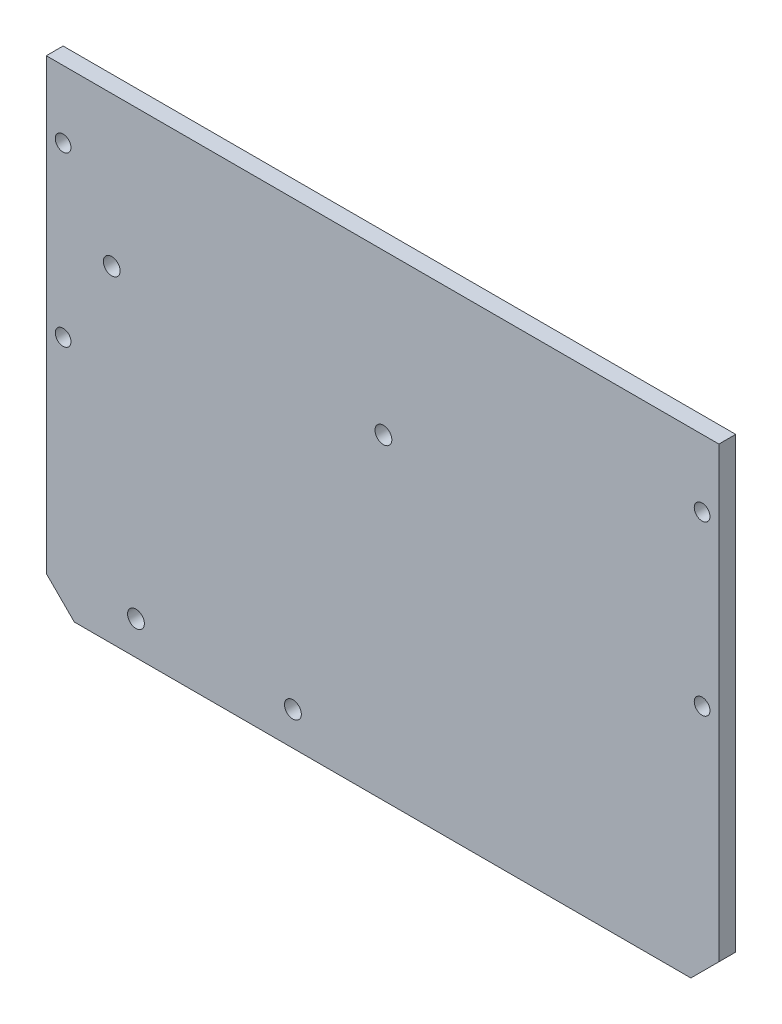
ISO-10303-21;
HEADER;
FILE_DESCRIPTION(('STEP AP214'),'2;1');
FILE_NAME('part.step','',(''),(''),'','','');
FILE_SCHEMA(('AUTOMOTIVE_DESIGN { 1 0 10303 214 1 1 1 1 }'));
ENDSEC;
DATA;
#1=APPLICATION_CONTEXT('core data for automotive mechanical design processes');
#2=APPLICATION_PROTOCOL_DEFINITION('international standard','automotive_design',2000,#1);
#3=PRODUCT_CONTEXT('',#1,'mechanical');
#4=PRODUCT('Part','Part','',(#3));
#5=PRODUCT_RELATED_PRODUCT_CATEGORY('part','',(#4));
#6=PRODUCT_DEFINITION_FORMATION('','',#4);
#7=PRODUCT_DEFINITION_CONTEXT('part definition',#1,'design');
#8=PRODUCT_DEFINITION('design','',#6,#7);
#9=PRODUCT_DEFINITION_SHAPE('','',#8);
#10=(LENGTH_UNIT() NAMED_UNIT(*) SI_UNIT(.MILLI.,.METRE.));
#11=(NAMED_UNIT(*) PLANE_ANGLE_UNIT() SI_UNIT($,.RADIAN.));
#12=(NAMED_UNIT(*) SI_UNIT($,.STERADIAN.) SOLID_ANGLE_UNIT());
#13=UNCERTAINTY_MEASURE_WITH_UNIT(LENGTH_MEASURE(1.E-05),#10,'distance_accuracy_value','');
#14=(GEOMETRIC_REPRESENTATION_CONTEXT(3) GLOBAL_UNCERTAINTY_ASSIGNED_CONTEXT((#13)) GLOBAL_UNIT_ASSIGNED_CONTEXT((#10,
#11,#12)) REPRESENTATION_CONTEXT('',''));
#15=CARTESIAN_POINT('',(0.,0.,0.));
#16=DIRECTION('',(0.,0.,1.));
#17=DIRECTION('',(1.,0.,0.));
#18=AXIS2_PLACEMENT_3D('',#15,#16,#17);
#19=CARTESIAN_POINT('',(60.,42.5,3.));
#20=DIRECTION('',(-1.,0.,0.));
#21=DIRECTION('',(0.,-1.,0.));
#22=AXIS2_PLACEMENT_3D('',#19,#20,#21);
#23=PLANE('',#22);
#24=DIRECTION('',(0.,1.,0.));
#25=VECTOR('',#24,1.);
#26=CARTESIAN_POINT('',(60.,42.5,3.));
#27=LINE('',#26,#25);
#28=CARTESIAN_POINT('',(60.,-37.5,3.));
#29=VERTEX_POINT('',#28);
#30=CARTESIAN_POINT('',(60.,42.5,3.));
#31=VERTEX_POINT('',#30);
#32=EDGE_CURVE('E91',#29,#31,#27,.T.);
#33=ORIENTED_EDGE('',*,*,#32,.F.);
#34=DIRECTION('',(0.,0.,-1.));
#35=VECTOR('',#34,1.);
#36=CARTESIAN_POINT('',(60.,-37.5,3.));
#37=LINE('',#36,#35);
#38=CARTESIAN_POINT('',(60.,-37.5,0.));
#39=VERTEX_POINT('',#38);
#40=EDGE_CURVE('E114',#29,#39,#37,.T.);
#41=ORIENTED_EDGE('',*,*,#40,.T.);
#42=DIRECTION('',(0.,1.,0.));
#43=VECTOR('',#42,1.);
#44=CARTESIAN_POINT('',(60.,42.5,0.));
#45=LINE('',#44,#43);
#46=CARTESIAN_POINT('',(60.,42.5,0.));
#47=VERTEX_POINT('',#46);
#48=EDGE_CURVE('E112',#39,#47,#45,.T.);
#49=ORIENTED_EDGE('',*,*,#48,.T.);
#50=DIRECTION('',(0.,0.,-1.));
#51=VECTOR('',#50,1.);
#52=CARTESIAN_POINT('',(60.,42.5,3.));
#53=LINE('',#52,#51);
#54=EDGE_CURVE('E106',#31,#47,#53,.T.);
#55=ORIENTED_EDGE('',*,*,#54,.F.);
#56=EDGE_LOOP('',(#33,#41,#49,#55));
#57=FACE_BOUND('',#56,.T.);
#58=ADVANCED_FACE('F37',(#57),#23,.F.);
#59=CARTESIAN_POINT('',(-60.,42.5,3.));
#60=DIRECTION('',(0.,-1.,0.));
#61=DIRECTION('',(0.,0.,-1.));
#62=AXIS2_PLACEMENT_3D('',#59,#60,#61);
#63=PLANE('',#62);
#64=DIRECTION('',(-1.,0.,0.));
#65=VECTOR('',#64,1.);
#66=CARTESIAN_POINT('',(-60.,42.5,0.));
#67=LINE('',#66,#65);
#68=CARTESIAN_POINT('',(-60.,42.5,0.));
#69=VERTEX_POINT('',#68);
#70=EDGE_CURVE('E141',#47,#69,#67,.T.);
#71=ORIENTED_EDGE('',*,*,#70,.T.);
#72=DIRECTION('',(0.,0.,-1.));
#73=VECTOR('',#72,1.);
#74=CARTESIAN_POINT('',(-60.,42.5,3.));
#75=LINE('',#74,#73);
#76=CARTESIAN_POINT('',(-60.,42.5,3.));
#77=VERTEX_POINT('',#76);
#78=EDGE_CURVE('E108',#77,#69,#75,.T.);
#79=ORIENTED_EDGE('',*,*,#78,.F.);
#80=DIRECTION('',(-1.,0.,0.));
#81=VECTOR('',#80,1.);
#82=CARTESIAN_POINT('',(-60.,42.5,3.));
#83=LINE('',#82,#81);
#84=EDGE_CURVE('E94',#31,#77,#83,.T.);
#85=ORIENTED_EDGE('',*,*,#84,.F.);
#86=ORIENTED_EDGE('',*,*,#54,.T.);
#87=EDGE_LOOP('',(#71,#79,#85,#86));
#88=FACE_BOUND('',#87,.T.);
#89=ADVANCED_FACE('F105',(#88),#63,.F.);
#90=CARTESIAN_POINT('',(-60.,42.5,3.));
#91=DIRECTION('',(1.,0.,0.));
#92=DIRECTION('',(0.,1.,0.));
#93=AXIS2_PLACEMENT_3D('',#90,#91,#92);
#94=PLANE('',#93);
#95=DIRECTION('',(0.,-1.,0.));
#96=VECTOR('',#95,1.);
#97=CARTESIAN_POINT('',(-60.,42.5,0.));
#98=LINE('',#97,#96);
#99=CARTESIAN_POINT('',(-60.,-37.5,0.));
#100=VERTEX_POINT('',#99);
#101=EDGE_CURVE('E139',#69,#100,#98,.T.);
#102=ORIENTED_EDGE('',*,*,#101,.T.);
#103=DIRECTION('',(0.,0.,1.));
#104=VECTOR('',#103,1.);
#105=CARTESIAN_POINT('',(-60.,-37.5,3.));
#106=LINE('',#105,#104);
#107=CARTESIAN_POINT('',(-60.,-37.5,3.));
#108=VERTEX_POINT('',#107);
#109=EDGE_CURVE('E11',#100,#108,#106,.T.);
#110=ORIENTED_EDGE('',*,*,#109,.T.);
#111=DIRECTION('',(0.,-1.,0.));
#112=VECTOR('',#111,1.);
#113=CARTESIAN_POINT('',(-60.,42.5,3.));
#114=LINE('',#113,#112);
#115=EDGE_CURVE('E109',#77,#108,#114,.T.);
#116=ORIENTED_EDGE('',*,*,#115,.F.);
#117=ORIENTED_EDGE('',*,*,#78,.T.);
#118=EDGE_LOOP('',(#102,#110,#116,#117));
#119=FACE_BOUND('',#118,.T.);
#120=ADVANCED_FACE('F140',(#119),#94,.F.);
#121=CARTESIAN_POINT('',(-60.,-42.5,3.));
#122=DIRECTION('',(0.,1.,0.));
#123=DIRECTION('',(0.,0.,1.));
#124=AXIS2_PLACEMENT_3D('',#121,#122,#123);
#125=PLANE('',#124);
#126=DIRECTION('',(1.,0.,0.));
#127=VECTOR('',#126,1.);
#128=CARTESIAN_POINT('',(-60.,-42.5,0.));
#129=LINE('',#128,#127);
#130=CARTESIAN_POINT('',(-55.,-42.5,0.));
#131=VERTEX_POINT('',#130);
#132=CARTESIAN_POINT('',(55.,-42.5,0.));
#133=VERTEX_POINT('',#132);
#134=EDGE_CURVE('E101',#131,#133,#129,.T.);
#135=ORIENTED_EDGE('',*,*,#134,.T.);
#136=DIRECTION('',(0.,0.,1.));
#137=VECTOR('',#136,1.);
#138=CARTESIAN_POINT('',(55.,-42.5,3.));
#139=LINE('',#138,#137);
#140=CARTESIAN_POINT('',(55.,-42.5,3.));
#141=VERTEX_POINT('',#140);
#142=EDGE_CURVE('E58',#133,#141,#139,.T.);
#143=ORIENTED_EDGE('',*,*,#142,.T.);
#144=DIRECTION('',(1.,0.,0.));
#145=VECTOR('',#144,1.);
#146=CARTESIAN_POINT('',(-60.,-42.5,3.));
#147=LINE('',#146,#145);
#148=CARTESIAN_POINT('',(-55.,-42.5,3.));
#149=VERTEX_POINT('',#148);
#150=EDGE_CURVE('E118',#149,#141,#147,.T.);
#151=ORIENTED_EDGE('',*,*,#150,.F.);
#152=DIRECTION('',(0.,0.,-1.));
#153=VECTOR('',#152,1.);
#154=CARTESIAN_POINT('',(-55.,-42.5,3.));
#155=LINE('',#154,#153);
#156=EDGE_CURVE('E125',#149,#131,#155,.T.);
#157=ORIENTED_EDGE('',*,*,#156,.T.);
#158=EDGE_LOOP('',(#135,#143,#151,#157));
#159=FACE_BOUND('',#158,.T.);
#160=ADVANCED_FACE('F133',(#159),#125,.F.);
#161=CARTESIAN_POINT('',(0.,0.,3.));
#162=DIRECTION('',(0.,0.,1.));
#163=DIRECTION('',(1.,0.,0.));
#164=AXIS2_PLACEMENT_3D('',#161,#162,#163);
#165=PLANE('',#164);
#166=CARTESIAN_POINT('',(-16.,-36.5,3.));
#167=DIRECTION('',(0.,0.,1.));
#168=DIRECTION('',(1.,0.,0.));
#169=AXIS2_PLACEMENT_3D('',#166,#167,#168);
#170=CIRCLE('',#169,1.5);
#171=CARTESIAN_POINT('',(-14.5,-36.5,3.));
#172=VERTEX_POINT('',#171);
#173=EDGE_CURVE('E190',#172,#172,#170,.T.);
#174=ORIENTED_EDGE('',*,*,#173,.F.);
#175=EDGE_LOOP('',(#174));
#176=FACE_BOUND('',#175,.T.);
#177=CARTESIAN_POINT('',(-48.3214285714286,15.8218430017716,3.));
#178=DIRECTION('',(0.,0.,1.));
#179=DIRECTION('',(1.,0.,0.));
#180=AXIS2_PLACEMENT_3D('',#177,#178,#179);
#181=CIRCLE('',#180,1.5);
#182=CARTESIAN_POINT('',(-46.8214285714286,15.8218430017716,3.));
#183=VERTEX_POINT('',#182);
#184=EDGE_CURVE('E184',#183,#183,#181,.T.);
#185=ORIENTED_EDGE('',*,*,#184,.F.);
#186=EDGE_LOOP('',(#185));
#187=FACE_BOUND('',#186,.T.);
#188=CARTESIAN_POINT('',(0.143643099769671,13.9815093620155,3.));
#189=DIRECTION('',(0.,0.,1.));
#190=DIRECTION('',(1.,0.,0.));
#191=AXIS2_PLACEMENT_3D('',#188,#189,#190);
#192=CIRCLE('',#191,1.5);
#193=CARTESIAN_POINT('',(1.64364309976967,13.9815093620155,3.));
#194=VERTEX_POINT('',#193);
#195=EDGE_CURVE('E178',#194,#194,#192,.T.);
#196=ORIENTED_EDGE('',*,*,#195,.F.);
#197=EDGE_LOOP('',(#196));
#198=FACE_BOUND('',#197,.T.);
#199=CARTESIAN_POINT('',(-44.,-36.5,3.));
#200=DIRECTION('',(0.,0.,1.));
#201=DIRECTION('',(1.,0.,0.));
#202=AXIS2_PLACEMENT_3D('',#199,#200,#201);
#203=CIRCLE('',#202,1.5);
#204=CARTESIAN_POINT('',(-42.5,-36.5,3.));
#205=VERTEX_POINT('',#204);
#206=EDGE_CURVE('E172',#205,#205,#203,.T.);
#207=ORIENTED_EDGE('',*,*,#206,.F.);
#208=EDGE_LOOP('',(#207));
#209=FACE_BOUND('',#208,.T.);
#210=CARTESIAN_POINT('',(-57.,0.500000000000004,3.));
#211=DIRECTION('',(0.,0.,1.));
#212=DIRECTION('',(1.,0.,0.));
#213=AXIS2_PLACEMENT_3D('',#210,#211,#212);
#214=CIRCLE('',#213,1.4);
#215=CARTESIAN_POINT('',(-55.6,0.500000000000004,3.));
#216=VERTEX_POINT('',#215);
#217=EDGE_CURVE('E167',#216,#216,#214,.T.);
#218=ORIENTED_EDGE('',*,*,#217,.F.);
#219=EDGE_LOOP('',(#218));
#220=FACE_BOUND('',#219,.T.);
#221=CARTESIAN_POINT('',(57.,30.5,3.));
#222=DIRECTION('',(0.,0.,1.));
#223=DIRECTION('',(-1.,0.,0.));
#224=AXIS2_PLACEMENT_3D('',#221,#222,#223);
#225=CIRCLE('',#224,1.4);
#226=CARTESIAN_POINT('',(55.6,30.5,3.));
#227=VERTEX_POINT('',#226);
#228=EDGE_CURVE('E161',#227,#227,#225,.T.);
#229=ORIENTED_EDGE('',*,*,#228,.F.);
#230=EDGE_LOOP('',(#229));
#231=FACE_BOUND('',#230,.T.);
#232=CARTESIAN_POINT('',(57.,0.500000000000018,3.));
#233=DIRECTION('',(0.,0.,1.));
#234=DIRECTION('',(-1.,0.,0.));
#235=AXIS2_PLACEMENT_3D('',#232,#233,#234);
#236=CIRCLE('',#235,1.4);
#237=CARTESIAN_POINT('',(55.6,0.500000000000018,3.));
#238=VERTEX_POINT('',#237);
#239=EDGE_CURVE('E154',#238,#238,#236,.T.);
#240=ORIENTED_EDGE('',*,*,#239,.F.);
#241=EDGE_LOOP('',(#240));
#242=FACE_BOUND('',#241,.T.);
#243=CARTESIAN_POINT('',(-57.,30.5,3.));
#244=DIRECTION('',(0.,0.,1.));
#245=DIRECTION('',(1.,0.,0.));
#246=AXIS2_PLACEMENT_3D('',#243,#244,#245);
#247=CIRCLE('',#246,1.4);
#248=CARTESIAN_POINT('',(-55.6,30.5,3.));
#249=VERTEX_POINT('',#248);
#250=EDGE_CURVE('E148',#249,#249,#247,.T.);
#251=ORIENTED_EDGE('',*,*,#250,.F.);
#252=EDGE_LOOP('',(#251));
#253=FACE_BOUND('',#252,.T.);
#254=ORIENTED_EDGE('',*,*,#150,.T.);
#255=DIRECTION('',(-0.70710678118655,-0.707106781186546,0.));
#256=VECTOR('',#255,1.);
#257=CARTESIAN_POINT('',(48.7499999999998,-48.7500000000001,3.));
#258=LINE('',#257,#256);
#259=EDGE_CURVE('E45',#141,#29,#258,.F.);
#260=ORIENTED_EDGE('',*,*,#259,.T.);
#261=ORIENTED_EDGE('',*,*,#32,.T.);
#262=ORIENTED_EDGE('',*,*,#84,.T.);
#263=ORIENTED_EDGE('',*,*,#115,.T.);
#264=DIRECTION('',(-0.707106781186547,0.707106781186548,0.));
#265=VECTOR('',#264,1.);
#266=CARTESIAN_POINT('',(-48.7500000000001,-48.7499999999999,3.));
#267=LINE('',#266,#265);
#268=EDGE_CURVE('E129',#108,#149,#267,.F.);
#269=ORIENTED_EDGE('',*,*,#268,.T.);
#270=EDGE_LOOP('',(#254,#260,#261,#262,#263,#269));
#271=FACE_BOUND('',#270,.T.);
#272=ADVANCED_FACE('F93',(#176,#187,#198,#209,#220,#231,#242,#253,#271),#165,.T.);
#273=CARTESIAN_POINT('',(0.,0.,0.));
#274=DIRECTION('',(0.,0.,1.));
#275=DIRECTION('',(1.,0.,0.));
#276=AXIS2_PLACEMENT_3D('',#273,#274,#275);
#277=PLANE('',#276);
#278=CARTESIAN_POINT('',(-16.,-36.5,0.));
#279=DIRECTION('',(0.,0.,1.));
#280=DIRECTION('',(1.,0.,0.));
#281=AXIS2_PLACEMENT_3D('',#278,#279,#280);
#282=CIRCLE('',#281,1.5);
#283=CARTESIAN_POINT('',(-14.5,-36.5,0.));
#284=VERTEX_POINT('',#283);
#285=EDGE_CURVE('E175',#284,#284,#282,.T.);
#286=ORIENTED_EDGE('',*,*,#285,.T.);
#287=EDGE_LOOP('',(#286));
#288=FACE_BOUND('',#287,.T.);
#289=CARTESIAN_POINT('',(-48.3214285714286,15.8218430017716,0.));
#290=DIRECTION('',(0.,0.,1.));
#291=DIRECTION('',(1.,0.,0.));
#292=AXIS2_PLACEMENT_3D('',#289,#290,#291);
#293=CIRCLE('',#292,1.5);
#294=CARTESIAN_POINT('',(-46.8214285714286,15.8218430017716,0.));
#295=VERTEX_POINT('',#294);
#296=EDGE_CURVE('E187',#295,#295,#293,.T.);
#297=ORIENTED_EDGE('',*,*,#296,.T.);
#298=EDGE_LOOP('',(#297));
#299=FACE_BOUND('',#298,.T.);
#300=CARTESIAN_POINT('',(0.143643099769671,13.9815093620155,0.));
#301=DIRECTION('',(0.,0.,1.));
#302=DIRECTION('',(1.,0.,0.));
#303=AXIS2_PLACEMENT_3D('',#300,#301,#302);
#304=CIRCLE('',#303,1.5);
#305=CARTESIAN_POINT('',(1.64364309976967,13.9815093620155,0.));
#306=VERTEX_POINT('',#305);
#307=EDGE_CURVE('E181',#306,#306,#304,.T.);
#308=ORIENTED_EDGE('',*,*,#307,.T.);
#309=EDGE_LOOP('',(#308));
#310=FACE_BOUND('',#309,.T.);
#311=CARTESIAN_POINT('',(-44.,-36.5,0.));
#312=DIRECTION('',(0.,0.,1.));
#313=DIRECTION('',(1.,0.,0.));
#314=AXIS2_PLACEMENT_3D('',#311,#312,#313);
#315=CIRCLE('',#314,1.5);
#316=CARTESIAN_POINT('',(-42.5,-36.5,0.));
#317=VERTEX_POINT('',#316);
#318=EDGE_CURVE('E158',#317,#317,#315,.T.);
#319=ORIENTED_EDGE('',*,*,#318,.T.);
#320=EDGE_LOOP('',(#319));
#321=FACE_BOUND('',#320,.T.);
#322=CARTESIAN_POINT('',(-57.,0.500000000000004,0.));
#323=DIRECTION('',(0.,0.,1.));
#324=DIRECTION('',(1.,0.,0.));
#325=AXIS2_PLACEMENT_3D('',#322,#323,#324);
#326=CIRCLE('',#325,1.4);
#327=CARTESIAN_POINT('',(-55.6,0.500000000000004,0.));
#328=VERTEX_POINT('',#327);
#329=EDGE_CURVE('E151',#328,#328,#326,.T.);
#330=ORIENTED_EDGE('',*,*,#329,.T.);
#331=EDGE_LOOP('',(#330));
#332=FACE_BOUND('',#331,.T.);
#333=CARTESIAN_POINT('',(57.,30.5,0.));
#334=DIRECTION('',(0.,0.,1.));
#335=DIRECTION('',(-1.,0.,0.));
#336=AXIS2_PLACEMENT_3D('',#333,#334,#335);
#337=CIRCLE('',#336,1.4);
#338=CARTESIAN_POINT('',(55.6,30.5,0.));
#339=VERTEX_POINT('',#338);
#340=EDGE_CURVE('E164',#339,#339,#337,.T.);
#341=ORIENTED_EDGE('',*,*,#340,.T.);
#342=EDGE_LOOP('',(#341));
#343=FACE_BOUND('',#342,.T.);
#344=CARTESIAN_POINT('',(57.,0.500000000000018,0.));
#345=DIRECTION('',(0.,0.,1.));
#346=DIRECTION('',(-1.,0.,0.));
#347=AXIS2_PLACEMENT_3D('',#344,#345,#346);
#348=CIRCLE('',#347,1.4);
#349=CARTESIAN_POINT('',(55.6,0.500000000000018,0.));
#350=VERTEX_POINT('',#349);
#351=EDGE_CURVE('E157',#350,#350,#348,.T.);
#352=ORIENTED_EDGE('',*,*,#351,.T.);
#353=EDGE_LOOP('',(#352));
#354=FACE_BOUND('',#353,.T.);
#355=CARTESIAN_POINT('',(-57.,30.5,0.));
#356=DIRECTION('',(0.,0.,1.));
#357=DIRECTION('',(1.,0.,0.));
#358=AXIS2_PLACEMENT_3D('',#355,#356,#357);
#359=CIRCLE('',#358,1.4);
#360=CARTESIAN_POINT('',(-55.6,30.5,0.));
#361=VERTEX_POINT('',#360);
#362=EDGE_CURVE('E145',#361,#361,#359,.T.);
#363=ORIENTED_EDGE('',*,*,#362,.T.);
#364=EDGE_LOOP('',(#363));
#365=FACE_BOUND('',#364,.T.);
#366=ORIENTED_EDGE('',*,*,#48,.F.);
#367=DIRECTION('',(0.70710678118655,0.707106781186546,0.));
#368=VECTOR('',#367,1.);
#369=CARTESIAN_POINT('',(60.,-37.5,0.));
#370=LINE('',#369,#368);
#371=EDGE_CURVE('E123',#39,#133,#370,.F.);
#372=ORIENTED_EDGE('',*,*,#371,.T.);
#373=ORIENTED_EDGE('',*,*,#134,.F.);
#374=DIRECTION('',(0.707106781186547,-0.707106781186548,0.));
#375=VECTOR('',#374,1.);
#376=CARTESIAN_POINT('',(-55.,-42.5,0.));
#377=LINE('',#376,#375);
#378=EDGE_CURVE('E116',#131,#100,#377,.F.);
#379=ORIENTED_EDGE('',*,*,#378,.T.);
#380=ORIENTED_EDGE('',*,*,#101,.F.);
#381=ORIENTED_EDGE('',*,*,#70,.F.);
#382=EDGE_LOOP('',(#366,#372,#373,#379,#380,#381));
#383=FACE_BOUND('',#382,.T.);
#384=ADVANCED_FACE('F138',(#288,#299,#310,#321,#332,#343,#354,#365,#383),#277,.F.);
#385=CARTESIAN_POINT('',(-57.,30.5,0.));
#386=DIRECTION('',(0.,0.,1.));
#387=DIRECTION('',(1.,0.,0.));
#388=AXIS2_PLACEMENT_3D('',#385,#386,#387);
#389=CYLINDRICAL_SURFACE('',#388,1.4);
#390=ORIENTED_EDGE('',*,*,#362,.F.);
#391=EDGE_LOOP('',(#390));
#392=FACE_BOUND('',#391,.T.);
#393=ORIENTED_EDGE('',*,*,#250,.T.);
#394=EDGE_LOOP('',(#393));
#395=FACE_BOUND('',#394,.T.);
#396=ADVANCED_FACE('F223',(#392,#395),#389,.F.);
#397=CARTESIAN_POINT('',(57.,0.500000000000018,0.));
#398=DIRECTION('',(0.,0.,1.));
#399=DIRECTION('',(1.,0.,0.));
#400=AXIS2_PLACEMENT_3D('',#397,#398,#399);
#401=CYLINDRICAL_SURFACE('',#400,1.4);
#402=ORIENTED_EDGE('',*,*,#351,.F.);
#403=EDGE_LOOP('',(#402));
#404=FACE_BOUND('',#403,.T.);
#405=ORIENTED_EDGE('',*,*,#239,.T.);
#406=EDGE_LOOP('',(#405));
#407=FACE_BOUND('',#406,.T.);
#408=ADVANCED_FACE('F225',(#404,#407),#401,.F.);
#409=CARTESIAN_POINT('',(57.,30.5,0.));
#410=DIRECTION('',(0.,0.,1.));
#411=DIRECTION('',(1.,0.,0.));
#412=AXIS2_PLACEMENT_3D('',#409,#410,#411);
#413=CYLINDRICAL_SURFACE('',#412,1.4);
#414=ORIENTED_EDGE('',*,*,#340,.F.);
#415=EDGE_LOOP('',(#414));
#416=FACE_BOUND('',#415,.T.);
#417=ORIENTED_EDGE('',*,*,#228,.T.);
#418=EDGE_LOOP('',(#417));
#419=FACE_BOUND('',#418,.T.);
#420=ADVANCED_FACE('F232',(#416,#419),#413,.F.);
#421=CARTESIAN_POINT('',(-57.,0.500000000000004,0.));
#422=DIRECTION('',(0.,0.,1.));
#423=DIRECTION('',(1.,0.,0.));
#424=AXIS2_PLACEMENT_3D('',#421,#422,#423);
#425=CYLINDRICAL_SURFACE('',#424,1.4);
#426=ORIENTED_EDGE('',*,*,#329,.F.);
#427=EDGE_LOOP('',(#426));
#428=FACE_BOUND('',#427,.T.);
#429=ORIENTED_EDGE('',*,*,#217,.T.);
#430=EDGE_LOOP('',(#429));
#431=FACE_BOUND('',#430,.T.);
#432=ADVANCED_FACE('F323',(#428,#431),#425,.F.);
#433=CARTESIAN_POINT('',(-44.,-36.5,0.));
#434=DIRECTION('',(0.,0.,1.));
#435=DIRECTION('',(1.,0.,0.));
#436=AXIS2_PLACEMENT_3D('',#433,#434,#435);
#437=CYLINDRICAL_SURFACE('',#436,1.5);
#438=ORIENTED_EDGE('',*,*,#318,.F.);
#439=EDGE_LOOP('',(#438));
#440=FACE_BOUND('',#439,.T.);
#441=ORIENTED_EDGE('',*,*,#206,.T.);
#442=EDGE_LOOP('',(#441));
#443=FACE_BOUND('',#442,.T.);
#444=ADVANCED_FACE('F313',(#440,#443),#437,.F.);
#445=CARTESIAN_POINT('',(0.143643099769671,13.9815093620155,0.));
#446=DIRECTION('',(0.,0.,1.));
#447=DIRECTION('',(1.,0.,0.));
#448=AXIS2_PLACEMENT_3D('',#445,#446,#447);
#449=CYLINDRICAL_SURFACE('',#448,1.5);
#450=ORIENTED_EDGE('',*,*,#307,.F.);
#451=EDGE_LOOP('',(#450));
#452=FACE_BOUND('',#451,.T.);
#453=ORIENTED_EDGE('',*,*,#195,.T.);
#454=EDGE_LOOP('',(#453));
#455=FACE_BOUND('',#454,.T.);
#456=ADVANCED_FACE('F303',(#452,#455),#449,.F.);
#457=CARTESIAN_POINT('',(-48.3214285714286,15.8218430017716,0.));
#458=DIRECTION('',(0.,0.,1.));
#459=DIRECTION('',(1.,0.,0.));
#460=AXIS2_PLACEMENT_3D('',#457,#458,#459);
#461=CYLINDRICAL_SURFACE('',#460,1.5);
#462=ORIENTED_EDGE('',*,*,#296,.F.);
#463=EDGE_LOOP('',(#462));
#464=FACE_BOUND('',#463,.T.);
#465=ORIENTED_EDGE('',*,*,#184,.T.);
#466=EDGE_LOOP('',(#465));
#467=FACE_BOUND('',#466,.T.);
#468=ADVANCED_FACE('F202',(#464,#467),#461,.F.);
#469=CARTESIAN_POINT('',(-16.,-36.5,0.));
#470=DIRECTION('',(0.,0.,1.));
#471=DIRECTION('',(1.,0.,0.));
#472=AXIS2_PLACEMENT_3D('',#469,#470,#471);
#473=CYLINDRICAL_SURFACE('',#472,1.5);
#474=ORIENTED_EDGE('',*,*,#285,.F.);
#475=EDGE_LOOP('',(#474));
#476=FACE_BOUND('',#475,.T.);
#477=ORIENTED_EDGE('',*,*,#173,.T.);
#478=EDGE_LOOP('',(#477));
#479=FACE_BOUND('',#478,.T.);
#480=ADVANCED_FACE('F198',(#476,#479),#473,.F.);
#481=CARTESIAN_POINT('',(60.,-37.5,3.));
#482=DIRECTION('',(-0.707106781186545,0.707106781186549,0.));
#483=DIRECTION('',(0.,0.,-1.));
#484=AXIS2_PLACEMENT_3D('',#481,#482,#483);
#485=PLANE('',#484);
#486=ORIENTED_EDGE('',*,*,#259,.F.);
#487=ORIENTED_EDGE('',*,*,#142,.F.);
#488=ORIENTED_EDGE('',*,*,#371,.F.);
#489=ORIENTED_EDGE('',*,*,#40,.F.);
#490=EDGE_LOOP('',(#486,#487,#488,#489));
#491=FACE_BOUND('',#490,.T.);
#492=ADVANCED_FACE('F201',(#491),#485,.F.);
#493=CARTESIAN_POINT('',(-55.,-42.5,3.));
#494=DIRECTION('',(0.707106781186548,0.707106781186547,0.));
#495=DIRECTION('',(0.,0.,-1.));
#496=AXIS2_PLACEMENT_3D('',#493,#494,#495);
#497=PLANE('',#496);
#498=ORIENTED_EDGE('',*,*,#268,.F.);
#499=ORIENTED_EDGE('',*,*,#109,.F.);
#500=ORIENTED_EDGE('',*,*,#378,.F.);
#501=ORIENTED_EDGE('',*,*,#156,.F.);
#502=EDGE_LOOP('',(#498,#499,#500,#501));
#503=FACE_BOUND('',#502,.T.);
#504=ADVANCED_FACE('F39',(#503),#497,.F.);
#505=CLOSED_SHELL('',(#58,#89,#120,#160,#272,#384,#396,#408,#420,#432,#444,#456,#468,#480,#492,#504));
#506=MANIFOLD_SOLID_BREP('B2',#505);
#507=ADVANCED_BREP_SHAPE_REPRESENTATION('',(#18,#506),#14);
#508=SHAPE_DEFINITION_REPRESENTATION(#9,#507);
ENDSEC;
END-ISO-10303-21;
